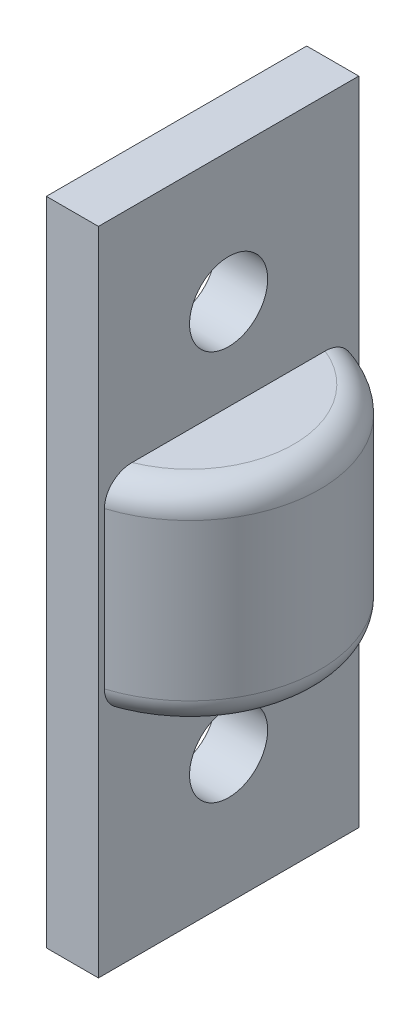
ISO-10303-21;
HEADER;
FILE_DESCRIPTION(('STEP AP214'),'2;1');
FILE_NAME('part.step','',(''),(''),'','','');
FILE_SCHEMA(('AUTOMOTIVE_DESIGN { 1 0 10303 214 1 1 1 1 }'));
ENDSEC;
DATA;
#1=APPLICATION_CONTEXT('core data for automotive mechanical design processes');
#2=APPLICATION_PROTOCOL_DEFINITION('international standard','automotive_design',2000,#1);
#3=PRODUCT_CONTEXT('',#1,'mechanical');
#4=PRODUCT('Part','Part','',(#3));
#5=PRODUCT_RELATED_PRODUCT_CATEGORY('part','',(#4));
#6=PRODUCT_DEFINITION_FORMATION('','',#4);
#7=PRODUCT_DEFINITION_CONTEXT('part definition',#1,'design');
#8=PRODUCT_DEFINITION('design','',#6,#7);
#9=PRODUCT_DEFINITION_SHAPE('','',#8);
#10=(LENGTH_UNIT() NAMED_UNIT(*) SI_UNIT(.MILLI.,.METRE.));
#11=(NAMED_UNIT(*) PLANE_ANGLE_UNIT() SI_UNIT($,.RADIAN.));
#12=(NAMED_UNIT(*) SI_UNIT($,.STERADIAN.) SOLID_ANGLE_UNIT());
#13=UNCERTAINTY_MEASURE_WITH_UNIT(LENGTH_MEASURE(1.E-05),#10,'distance_accuracy_value','');
#14=(GEOMETRIC_REPRESENTATION_CONTEXT(3) GLOBAL_UNCERTAINTY_ASSIGNED_CONTEXT((#13)) GLOBAL_UNIT_ASSIGNED_CONTEXT((#10,
#11,#12)) REPRESENTATION_CONTEXT('',''));
#15=CARTESIAN_POINT('',(0.,0.,0.));
#16=DIRECTION('',(0.,0.,1.));
#17=DIRECTION('',(1.,0.,0.));
#18=AXIS2_PLACEMENT_3D('',#15,#16,#17);
#19=CARTESIAN_POINT('',(-18.145,0.,0.));
#20=DIRECTION('',(-1.,0.,0.));
#21=DIRECTION('',(0.,0.,1.));
#22=AXIS2_PLACEMENT_3D('',#19,#20,#21);
#23=PLANE('',#22);
#24=DIRECTION('',(0.,0.,1.));
#25=VECTOR('',#24,1.);
#26=CARTESIAN_POINT('',(-18.145,44.,0.));
#27=LINE('',#26,#25);
#28=CARTESIAN_POINT('',(-18.145,44.,-3.70809924354784));
#29=VERTEX_POINT('',#28);
#30=CARTESIAN_POINT('',(-18.145,44.,3.70809924354783));
#31=VERTEX_POINT('',#30);
#32=EDGE_CURVE('E276',#29,#31,#27,.T.);
#33=ORIENTED_EDGE('',*,*,#32,.F.);
#34=CARTESIAN_POINT('',(-18.145,44.,-3.70809924354784));
#35=CARTESIAN_POINT('',(-18.145,44.0000446746882,-3.77102859400737));
#36=CARTESIAN_POINT('',(-18.145,43.9948961277134,-3.83399883726668));
#37=CARTESIAN_POINT('',(-18.145,43.9742609840635,-3.95834328277488));
#38=CARTESIAN_POINT('',(-18.145,43.958754051116,-4.01971409817624));
#39=CARTESIAN_POINT('',(-18.145,43.9174111192131,-4.13903451433262));
#40=CARTESIAN_POINT('',(-18.145,43.891555303476,-4.19697730511149));
#41=CARTESIAN_POINT('',(-18.145,43.8300151578696,-4.30732646589592));
#42=CARTESIAN_POINT('',(-18.145,43.7943420282415,-4.35973905142012));
#43=CARTESIAN_POINT('',(-18.145,43.7159910488128,-4.45479511595231));
#44=CARTESIAN_POINT('',(-18.145,43.6737411462038,-4.49779102539527));
#45=CARTESIAN_POINT('',(-18.145,43.5822190602416,-4.57557133751087));
#46=CARTESIAN_POINT('',(-18.145,43.5329460413457,-4.61035476183133));
#47=CARTESIAN_POINT('',(-18.145,43.4318401587707,-4.6686432086811));
#48=CARTESIAN_POINT('',(-18.145,43.3803104169747,-4.6926755056348));
#49=CARTESIAN_POINT('',(-18.145,43.2738685201121,-4.73132778720933));
#50=CARTESIAN_POINT('',(-18.145,43.2189610978374,-4.74596062734654));
#51=CARTESIAN_POINT('',(-18.145,43.1362834236849,-4.76031205030439));
#52=CARTESIAN_POINT('',(-18.145,43.1091245864456,-4.76383034109844));
#53=CARTESIAN_POINT('',(-18.145,43.0546484674691,-4.76852044482377));
#54=CARTESIAN_POINT('',(-18.145,43.0273315053115,-4.76969597014627));
#55=CARTESIAN_POINT('',(-18.145,43.0000000000001,-4.7696960070853));
#56=B_SPLINE_CURVE_WITH_KNOTS('',3,(#34,#35,#36,#37,#38,#39,#40,#41,#42,#43,#44,#45,#46,#47,#48,
#49,#50,#51,#52,#53,#54,#55),.UNSPECIFIED.,.F.,.F.,(4,2,2,2,2,2,2,2,2,2,4),(0.,
0.188641243323365,0.377653932466057,0.567030301565425,0.756191506888005,0.936100666565799,
1.11603124799425,1.28576923499191,1.45527457643828,1.53734522992803,1.61928572894716),.UNSPECIFIED.);
#57=CARTESIAN_POINT('',(-18.145,43.,-4.76969600708474));
#58=VERTEX_POINT('',#57);
#59=EDGE_CURVE('E79',#29,#58,#56,.T.);
#60=ORIENTED_EDGE('',*,*,#59,.T.);
#61=DIRECTION('',(0.,1.,0.));
#62=VECTOR('',#61,1.);
#63=CARTESIAN_POINT('',(-18.145,36.,-4.76969600708474));
#64=LINE('',#63,#62);
#65=CARTESIAN_POINT('',(-18.145,37.,-4.76969600708474));
#66=VERTEX_POINT('',#65);
#67=EDGE_CURVE('E243',#58,#66,#64,.F.);
#68=ORIENTED_EDGE('',*,*,#67,.T.);
#69=CARTESIAN_POINT('',(-18.145,37.,-4.76969600708474));
#70=CARTESIAN_POINT('',(-18.145,36.9728613139467,-4.76969635914148));
#71=CARTESIAN_POINT('',(-18.145,36.9457359090888,-4.76853712593869));
#72=CARTESIAN_POINT('',(-18.145,36.8916852893732,-4.76391614830527));
#73=CARTESIAN_POINT('',(-18.145,36.8647600501857,-4.76045468849165));
#74=CARTESIAN_POINT('',(-18.145,36.7846819302502,-4.74666684001058));
#75=CARTESIAN_POINT('',(-18.145,36.7320755550965,-4.73293676807672));
#76=CARTESIAN_POINT('',(-18.145,36.6299337068901,-4.6968653817904));
#77=CARTESIAN_POINT('',(-18.145,36.5803985756353,-4.67452311097832));
#78=CARTESIAN_POINT('',(-18.145,36.4856890099206,-4.62196987080802));
#79=CARTESIAN_POINT('',(-18.145,36.4405151740703,-4.59175782338197));
#80=CARTESIAN_POINT('',(-18.145,36.3549484462929,-4.52386060747544));
#81=CARTESIAN_POINT('',(-18.145,36.3146484855173,-4.48605855971889));
#82=CARTESIAN_POINT('',(-18.145,36.2406469831803,-4.40447784597852));
#83=CARTESIAN_POINT('',(-18.145,36.2069464121679,-4.36069830251006));
#84=CARTESIAN_POINT('',(-18.145,36.1454971682573,-4.26639809644509));
#85=CARTESIAN_POINT('',(-18.145,36.1180726458081,-4.21566655232883));
#86=CARTESIAN_POINT('',(-18.145,36.0716017392263,-4.11048517581056));
#87=CARTESIAN_POINT('',(-18.145,36.0525589864421,-4.05603374356923));
#88=CARTESIAN_POINT('',(-18.145,36.0251846684092,-3.9527822243443));
#89=CARTESIAN_POINT('',(-18.145,36.0157158103072,-3.90427812762391));
#90=CARTESIAN_POINT('',(-18.145,36.0031231493299,-3.80654596165672));
#91=CARTESIAN_POINT('',(-18.145,35.9999871322951,-3.75731947085155));
#92=CARTESIAN_POINT('',(-18.145,36.,-3.70809924354784));
#93=B_SPLINE_CURVE_WITH_KNOTS('',3,(#69,#70,#71,#72,#73,#74,#75,#76,#77,#78,#79,#80,#81,#82,#83,
#84,#85,#86,#87,#88,#89,#90,#91,#92),.UNSPECIFIED.,.F.,.F.,(4,2,2,2,2,2,2,2,2,2,2,4),(0.,
0.0813650770143812,0.162720096990514,0.324982741139785,0.487263411161867,0.649566323449299,
0.814592353526024,0.979642635198515,1.15189995289374,1.32423182669581,1.47208339913565,
1.61964953663185),.UNSPECIFIED.);
#94=CARTESIAN_POINT('',(-18.145,36.,-3.70809924354784));
#95=VERTEX_POINT('',#94);
#96=EDGE_CURVE('E191',#66,#95,#93,.T.);
#97=ORIENTED_EDGE('',*,*,#96,.T.);
#98=DIRECTION('',(0.,0.,1.));
#99=VECTOR('',#98,1.);
#100=CARTESIAN_POINT('',(-18.145,36.,0.));
#101=LINE('',#100,#99);
#102=CARTESIAN_POINT('',(-18.145,36.,3.70809924354783));
#103=VERTEX_POINT('',#102);
#104=EDGE_CURVE('E273',#95,#103,#101,.T.);
#105=ORIENTED_EDGE('',*,*,#104,.T.);
#106=CARTESIAN_POINT('',(-18.145,36.,3.70809924354783));
#107=CARTESIAN_POINT('',(-18.145,35.9999553253118,3.77102859400736));
#108=CARTESIAN_POINT('',(-18.145,36.0051038722866,3.83399883726667));
#109=CARTESIAN_POINT('',(-18.145,36.0257390159365,3.95834328277487));
#110=CARTESIAN_POINT('',(-18.145,36.041245948884,4.01971409817623));
#111=CARTESIAN_POINT('',(-18.145,36.0825888807869,4.13903451433261));
#112=CARTESIAN_POINT('',(-18.145,36.108444696524,4.19697730511148));
#113=CARTESIAN_POINT('',(-18.145,36.1699848421304,4.3073264658959));
#114=CARTESIAN_POINT('',(-18.145,36.2056579717585,4.35973905142011));
#115=CARTESIAN_POINT('',(-18.145,36.2840089511872,4.4547951159523));
#116=CARTESIAN_POINT('',(-18.145,36.3262588537962,4.49779102539526));
#117=CARTESIAN_POINT('',(-18.145,36.4177809397584,4.57557133751087));
#118=CARTESIAN_POINT('',(-18.145,36.4670539586543,4.61035476183132));
#119=CARTESIAN_POINT('',(-18.145,36.5681598412293,4.66864320868109));
#120=CARTESIAN_POINT('',(-18.145,36.6196895830253,4.69267550563478));
#121=CARTESIAN_POINT('',(-18.145,36.7261314798879,4.73132778720932));
#122=CARTESIAN_POINT('',(-18.145,36.7810389021626,4.74596062734653));
#123=CARTESIAN_POINT('',(-18.145,36.8637165763151,4.76031205030439));
#124=CARTESIAN_POINT('',(-18.145,36.8908754135544,4.76383034109843));
#125=CARTESIAN_POINT('',(-18.145,36.9453515325309,4.76852044482376));
#126=CARTESIAN_POINT('',(-18.145,36.9726684946885,4.76969597014626));
#127=CARTESIAN_POINT('',(-18.145,36.9999999999999,4.76969600708529));
#128=B_SPLINE_CURVE_WITH_KNOTS('',3,(#106,#107,#108,#109,#110,#111,#112,#113,#114,#115,#116,
#117,#118,#119,#120,#121,#122,#123,#124,#125,#126,#127),.UNSPECIFIED.,.F.,.F.,(4,2,2,2,2,2,2,2,
2,2,4),(0.,0.188641243323364,0.377653932466055,0.567030301565422,0.756191506887999,
0.936100666565806,1.11603124799424,1.2857692349919,1.45527457643828,1.53734522992803,
1.61928572894715),.UNSPECIFIED.);
#129=CARTESIAN_POINT('',(-18.145,37.,4.76969600708473));
#130=VERTEX_POINT('',#129);
#131=EDGE_CURVE('E197',#103,#130,#128,.T.);
#132=ORIENTED_EDGE('',*,*,#131,.T.);
#133=DIRECTION('',(0.,1.,0.));
#134=VECTOR('',#133,1.);
#135=CARTESIAN_POINT('',(-18.145,36.,4.76969600708473));
#136=LINE('',#135,#134);
#137=CARTESIAN_POINT('',(-18.145,43.,4.76969600708473));
#138=VERTEX_POINT('',#137);
#139=EDGE_CURVE('E239',#130,#138,#136,.T.);
#140=ORIENTED_EDGE('',*,*,#139,.T.);
#141=CARTESIAN_POINT('',(-18.145,43.,4.76969600708473));
#142=CARTESIAN_POINT('',(-18.145,43.0271386860533,4.76969635914147));
#143=CARTESIAN_POINT('',(-18.145,43.0542640909112,4.76853712593868));
#144=CARTESIAN_POINT('',(-18.145,43.1083147106268,4.76391614830526));
#145=CARTESIAN_POINT('',(-18.145,43.1352399498143,4.76045468849164));
#146=CARTESIAN_POINT('',(-18.145,43.2153180697498,4.74666684001057));
#147=CARTESIAN_POINT('',(-18.145,43.2679244449035,4.73293676807672));
#148=CARTESIAN_POINT('',(-18.145,43.3700662931099,4.69686538179039));
#149=CARTESIAN_POINT('',(-18.145,43.4196014243647,4.67452311097831));
#150=CARTESIAN_POINT('',(-18.145,43.5143109900794,4.62196987080801));
#151=CARTESIAN_POINT('',(-18.145,43.5594848259297,4.59175782338196));
#152=CARTESIAN_POINT('',(-18.145,43.6450515537071,4.52386060747544));
#153=CARTESIAN_POINT('',(-18.145,43.6853515144827,4.48605855971888));
#154=CARTESIAN_POINT('',(-18.145,43.7593530168197,4.40447784597851));
#155=CARTESIAN_POINT('',(-18.145,43.7930535878321,4.36069830251005));
#156=CARTESIAN_POINT('',(-18.145,43.8545028317427,4.26639809644508));
#157=CARTESIAN_POINT('',(-18.145,43.8819273541919,4.21566655232882));
#158=CARTESIAN_POINT('',(-18.145,43.9283982607737,4.11048517581055));
#159=CARTESIAN_POINT('',(-18.145,43.9474410135579,4.05603374356921));
#160=CARTESIAN_POINT('',(-18.145,43.9748153315908,3.95278222434429));
#161=CARTESIAN_POINT('',(-18.145,43.9842841896928,3.9042781276239));
#162=CARTESIAN_POINT('',(-18.145,43.9968768506701,3.80654596165671));
#163=CARTESIAN_POINT('',(-18.145,44.0000128677049,3.75731947085154));
#164=CARTESIAN_POINT('',(-18.145,44.,3.70809924354783));
#165=B_SPLINE_CURVE_WITH_KNOTS('',3,(#141,#142,#143,#144,#145,#146,#147,#148,#149,#150,#151,
#152,#153,#154,#155,#156,#157,#158,#159,#160,#161,#162,#163,#164),.UNSPECIFIED.,.F.,.F.,(4,2,2,
2,2,2,2,2,2,2,2,4),(0.,0.0813650770143811,0.162720096990514,0.324982741139785,0.487263411161868,
0.649566323449298,0.814592353526024,0.979642635198515,1.15189995289374,1.32423182669581,
1.47208339913565,1.61964953663185),.UNSPECIFIED.);
#166=EDGE_CURVE('E12',#138,#31,#165,.T.);
#167=ORIENTED_EDGE('',*,*,#166,.T.);
#168=EDGE_LOOP('',(#33,#60,#68,#97,#105,#132,#140,#167));
#169=FACE_BOUND('',#168,.T.);
#170=DIRECTION('',(0.,0.,-1.));
#171=VECTOR('',#170,1.);
#172=CARTESIAN_POINT('',(-18.145,52.5,5.));
#173=LINE('',#172,#171);
#174=CARTESIAN_POINT('',(-18.145,52.5,5.));
#175=VERTEX_POINT('',#174);
#176=CARTESIAN_POINT('',(-18.145,52.5,-4.99999999999999));
#177=VERTEX_POINT('',#176);
#178=EDGE_CURVE('E154',#175,#177,#173,.T.);
#179=ORIENTED_EDGE('',*,*,#178,.F.);
#180=DIRECTION('',(0.,1.,0.));
#181=VECTOR('',#180,1.);
#182=CARTESIAN_POINT('',(-18.145,27.5,4.99999999999999));
#183=LINE('',#182,#181);
#184=CARTESIAN_POINT('',(-18.145,27.5,4.99999999999999));
#185=VERTEX_POINT('',#184);
#186=EDGE_CURVE('E147',#185,#175,#183,.T.);
#187=ORIENTED_EDGE('',*,*,#186,.F.);
#188=DIRECTION('',(0.,0.,1.));
#189=VECTOR('',#188,1.);
#190=CARTESIAN_POINT('',(-18.145,27.5,-5.));
#191=LINE('',#190,#189);
#192=CARTESIAN_POINT('',(-18.145,27.5,-5.));
#193=VERTEX_POINT('',#192);
#194=EDGE_CURVE('E157',#193,#185,#191,.T.);
#195=ORIENTED_EDGE('',*,*,#194,.F.);
#196=DIRECTION('',(0.,-1.,0.));
#197=VECTOR('',#196,1.);
#198=CARTESIAN_POINT('',(-18.145,52.5,-4.99999999999999));
#199=LINE('',#198,#197);
#200=EDGE_CURVE('E139',#177,#193,#199,.T.);
#201=ORIENTED_EDGE('',*,*,#200,.F.);
#202=EDGE_LOOP('',(#179,#187,#195,#201));
#203=FACE_BOUND('',#202,.T.);
#204=CARTESIAN_POINT('',(-18.145,47.5,0.));
#205=DIRECTION('',(1.,0.,0.));
#206=DIRECTION('',(0.,0.,-1.));
#207=AXIS2_PLACEMENT_3D('',#204,#205,#206);
#208=CIRCLE('',#207,1.5);
#209=CARTESIAN_POINT('',(-18.145,47.5,-1.5));
#210=VERTEX_POINT('',#209);
#211=EDGE_CURVE('E174',#210,#210,#208,.T.);
#212=ORIENTED_EDGE('',*,*,#211,.F.);
#213=EDGE_LOOP('',(#212));
#214=FACE_BOUND('',#213,.T.);
#215=CARTESIAN_POINT('',(-18.145,32.5,0.));
#216=DIRECTION('',(1.,0.,0.));
#217=DIRECTION('',(0.,0.,-1.));
#218=AXIS2_PLACEMENT_3D('',#215,#216,#217);
#219=CIRCLE('',#218,1.5);
#220=CARTESIAN_POINT('',(-18.145,32.5,-1.5));
#221=VERTEX_POINT('',#220);
#222=EDGE_CURVE('E238',#221,#221,#219,.T.);
#223=ORIENTED_EDGE('',*,*,#222,.F.);
#224=EDGE_LOOP('',(#223));
#225=FACE_BOUND('',#224,.T.);
#226=ADVANCED_FACE('F65',(#169,#203,#214,#225),#23,.F.);
#227=CARTESIAN_POINT('',(-20.145,0.,0.));
#228=DIRECTION('',(-1.,0.,0.));
#229=DIRECTION('',(0.,0.,1.));
#230=AXIS2_PLACEMENT_3D('',#227,#228,#229);
#231=PLANE('',#230);
#232=CARTESIAN_POINT('',(-20.145,47.5,0.));
#233=DIRECTION('',(1.,0.,0.));
#234=DIRECTION('',(0.,0.,-1.));
#235=AXIS2_PLACEMENT_3D('',#232,#233,#234);
#236=CIRCLE('',#235,1.5);
#237=CARTESIAN_POINT('',(-20.145,47.5,-1.5));
#238=VERTEX_POINT('',#237);
#239=EDGE_CURVE('E167',#238,#238,#236,.T.);
#240=ORIENTED_EDGE('',*,*,#239,.T.);
#241=EDGE_LOOP('',(#240));
#242=FACE_BOUND('',#241,.T.);
#243=DIRECTION('',(0.,0.,-1.));
#244=VECTOR('',#243,1.);
#245=CARTESIAN_POINT('',(-20.145,52.5,5.));
#246=LINE('',#245,#244);
#247=CARTESIAN_POINT('',(-20.145,52.5,5.));
#248=VERTEX_POINT('',#247);
#249=CARTESIAN_POINT('',(-20.145,52.5,-4.99999999999999));
#250=VERTEX_POINT('',#249);
#251=EDGE_CURVE('E172',#248,#250,#246,.T.);
#252=ORIENTED_EDGE('',*,*,#251,.T.);
#253=DIRECTION('',(0.,-1.,0.));
#254=VECTOR('',#253,1.);
#255=CARTESIAN_POINT('',(-20.145,52.5,-4.99999999999999));
#256=LINE('',#255,#254);
#257=CARTESIAN_POINT('',(-20.145,27.5,-5.));
#258=VERTEX_POINT('',#257);
#259=EDGE_CURVE('E141',#250,#258,#256,.T.);
#260=ORIENTED_EDGE('',*,*,#259,.T.);
#261=DIRECTION('',(0.,0.,1.));
#262=VECTOR('',#261,1.);
#263=CARTESIAN_POINT('',(-20.145,27.5,-5.));
#264=LINE('',#263,#262);
#265=CARTESIAN_POINT('',(-20.145,27.5,4.99999999999999));
#266=VERTEX_POINT('',#265);
#267=EDGE_CURVE('E164',#258,#266,#264,.T.);
#268=ORIENTED_EDGE('',*,*,#267,.T.);
#269=DIRECTION('',(0.,1.,0.));
#270=VECTOR('',#269,1.);
#271=CARTESIAN_POINT('',(-20.145,27.5,4.99999999999999));
#272=LINE('',#271,#270);
#273=EDGE_CURVE('E161',#266,#248,#272,.T.);
#274=ORIENTED_EDGE('',*,*,#273,.T.);
#275=EDGE_LOOP('',(#252,#260,#268,#274));
#276=FACE_BOUND('',#275,.T.);
#277=CARTESIAN_POINT('',(-20.145,32.5,0.));
#278=DIRECTION('',(1.,0.,0.));
#279=DIRECTION('',(0.,0.,-1.));
#280=AXIS2_PLACEMENT_3D('',#277,#278,#279);
#281=CIRCLE('',#280,1.5);
#282=CARTESIAN_POINT('',(-20.145,32.5,-1.5));
#283=VERTEX_POINT('',#282);
#284=EDGE_CURVE('E236',#283,#283,#281,.T.);
#285=ORIENTED_EDGE('',*,*,#284,.T.);
#286=EDGE_LOOP('',(#285));
#287=FACE_BOUND('',#286,.T.);
#288=ADVANCED_FACE('F215',(#242,#276,#287),#231,.T.);
#289=CARTESIAN_POINT('',(-18.145,52.5,5.));
#290=DIRECTION('',(0.,1.,0.));
#291=DIRECTION('',(0.,0.,1.));
#292=AXIS2_PLACEMENT_3D('',#289,#290,#291);
#293=PLANE('',#292);
#294=ORIENTED_EDGE('',*,*,#251,.F.);
#295=DIRECTION('',(-1.,0.,0.));
#296=VECTOR('',#295,1.);
#297=CARTESIAN_POINT('',(-18.145,52.5,5.));
#298=LINE('',#297,#296);
#299=EDGE_CURVE('E160',#175,#248,#298,.T.);
#300=ORIENTED_EDGE('',*,*,#299,.F.);
#301=ORIENTED_EDGE('',*,*,#178,.T.);
#302=DIRECTION('',(-1.,0.,0.));
#303=VECTOR('',#302,1.);
#304=CARTESIAN_POINT('',(-18.145,52.5,-4.99999999999999));
#305=LINE('',#304,#303);
#306=EDGE_CURVE('E136',#177,#250,#305,.T.);
#307=ORIENTED_EDGE('',*,*,#306,.T.);
#308=EDGE_LOOP('',(#294,#300,#301,#307));
#309=FACE_BOUND('',#308,.T.);
#310=ADVANCED_FACE('F159',(#309),#293,.T.);
#311=CARTESIAN_POINT('',(-18.145,27.5,4.99999999999999));
#312=DIRECTION('',(0.,0.,1.));
#313=DIRECTION('',(0.,-1.,0.));
#314=AXIS2_PLACEMENT_3D('',#311,#312,#313);
#315=PLANE('',#314);
#316=ORIENTED_EDGE('',*,*,#273,.F.);
#317=DIRECTION('',(-1.,0.,0.));
#318=VECTOR('',#317,1.);
#319=CARTESIAN_POINT('',(-18.145,27.5,4.99999999999999));
#320=LINE('',#319,#318);
#321=EDGE_CURVE('E180',#185,#266,#320,.T.);
#322=ORIENTED_EDGE('',*,*,#321,.F.);
#323=ORIENTED_EDGE('',*,*,#186,.T.);
#324=ORIENTED_EDGE('',*,*,#299,.T.);
#325=EDGE_LOOP('',(#316,#322,#323,#324));
#326=FACE_BOUND('',#325,.T.);
#327=ADVANCED_FACE('F214',(#326),#315,.T.);
#328=CARTESIAN_POINT('',(-18.145,27.5,-5.));
#329=DIRECTION('',(0.,-1.,0.));
#330=DIRECTION('',(1.,0.,0.));
#331=AXIS2_PLACEMENT_3D('',#328,#329,#330);
#332=PLANE('',#331);
#333=ORIENTED_EDGE('',*,*,#267,.F.);
#334=DIRECTION('',(-1.,0.,0.));
#335=VECTOR('',#334,1.);
#336=CARTESIAN_POINT('',(-18.145,27.5,-5.));
#337=LINE('',#336,#335);
#338=EDGE_CURVE('E146',#193,#258,#337,.T.);
#339=ORIENTED_EDGE('',*,*,#338,.F.);
#340=ORIENTED_EDGE('',*,*,#194,.T.);
#341=ORIENTED_EDGE('',*,*,#321,.T.);
#342=EDGE_LOOP('',(#333,#339,#340,#341));
#343=FACE_BOUND('',#342,.T.);
#344=ADVANCED_FACE('F219',(#343),#332,.T.);
#345=CARTESIAN_POINT('',(-18.145,52.5,-4.99999999999999));
#346=DIRECTION('',(0.,0.,-1.));
#347=DIRECTION('',(0.,1.,0.));
#348=AXIS2_PLACEMENT_3D('',#345,#346,#347);
#349=PLANE('',#348);
#350=ORIENTED_EDGE('',*,*,#259,.F.);
#351=ORIENTED_EDGE('',*,*,#306,.F.);
#352=ORIENTED_EDGE('',*,*,#200,.T.);
#353=ORIENTED_EDGE('',*,*,#338,.T.);
#354=EDGE_LOOP('',(#350,#351,#352,#353));
#355=FACE_BOUND('',#354,.T.);
#356=ADVANCED_FACE('F138',(#355),#349,.T.);
#357=CARTESIAN_POINT('',(-18.145,47.5,0.));
#358=DIRECTION('',(-1.,0.,0.));
#359=DIRECTION('',(0.,0.,1.));
#360=AXIS2_PLACEMENT_3D('',#357,#358,#359);
#361=CYLINDRICAL_SURFACE('',#360,1.5);
#362=ORIENTED_EDGE('',*,*,#211,.T.);
#363=EDGE_LOOP('',(#362));
#364=FACE_BOUND('',#363,.T.);
#365=ORIENTED_EDGE('',*,*,#239,.F.);
#366=EDGE_LOOP('',(#365));
#367=FACE_BOUND('',#366,.T.);
#368=ADVANCED_FACE('F218',(#364,#367),#361,.F.);
#369=CARTESIAN_POINT('',(-18.145,32.5,0.));
#370=DIRECTION('',(-1.,0.,0.));
#371=DIRECTION('',(0.,0.,1.));
#372=AXIS2_PLACEMENT_3D('',#369,#370,#371);
#373=CYLINDRICAL_SURFACE('',#372,1.5);
#374=ORIENTED_EDGE('',*,*,#222,.T.);
#375=EDGE_LOOP('',(#374));
#376=FACE_BOUND('',#375,.T.);
#377=ORIENTED_EDGE('',*,*,#284,.F.);
#378=EDGE_LOOP('',(#377));
#379=FACE_BOUND('',#378,.T.);
#380=ADVANCED_FACE('F252',(#376,#379),#373,.F.);
#381=CARTESIAN_POINT('',(-19.645,36.,0.));
#382=DIRECTION('',(0.,1.,0.));
#383=DIRECTION('',(-1.,0.,0.));
#384=AXIS2_PLACEMENT_3D('',#381,#382,#383);
#385=CYLINDRICAL_SURFACE('',#384,5.);
#386=ORIENTED_EDGE('',*,*,#139,.F.);
#387=CARTESIAN_POINT('',(-19.645,37.,0.));
#388=DIRECTION('',(0.,-1.,0.));
#389=DIRECTION('',(1.,0.,0.));
#390=AXIS2_PLACEMENT_3D('',#387,#388,#389);
#391=CIRCLE('',#390,5.);
#392=EDGE_CURVE('E184',#130,#66,#391,.F.);
#393=ORIENTED_EDGE('',*,*,#392,.T.);
#394=ORIENTED_EDGE('',*,*,#67,.F.);
#395=CARTESIAN_POINT('',(-19.645,43.,0.));
#396=DIRECTION('',(0.,-1.,0.));
#397=DIRECTION('',(1.,0.,0.));
#398=AXIS2_PLACEMENT_3D('',#395,#396,#397);
#399=CIRCLE('',#398,5.);
#400=EDGE_CURVE('E179',#58,#138,#399,.T.);
#401=ORIENTED_EDGE('',*,*,#400,.T.);
#402=EDGE_LOOP('',(#386,#393,#394,#401));
#403=FACE_BOUND('',#402,.T.);
#404=ADVANCED_FACE('F254',(#403),#385,.T.);
#405=CARTESIAN_POINT('',(-19.645,36.,0.));
#406=DIRECTION('',(0.,-1.,0.));
#407=DIRECTION('',(1.,0.,0.));
#408=AXIS2_PLACEMENT_3D('',#405,#406,#407);
#409=PLANE('',#408);
#410=ORIENTED_EDGE('',*,*,#104,.F.);
#411=CARTESIAN_POINT('',(-19.645,36.,0.));
#412=DIRECTION('',(0.,-1.,0.));
#413=DIRECTION('',(1.,0.,0.));
#414=AXIS2_PLACEMENT_3D('',#411,#412,#413);
#415=CIRCLE('',#414,4.);
#416=EDGE_CURVE('E187',#95,#103,#415,.T.);
#417=ORIENTED_EDGE('',*,*,#416,.T.);
#418=EDGE_LOOP('',(#410,#417));
#419=FACE_BOUND('',#418,.T.);
#420=ADVANCED_FACE('F260',(#419),#409,.T.);
#421=CARTESIAN_POINT('',(-19.645,44.,0.));
#422=DIRECTION('',(0.,-1.,0.));
#423=DIRECTION('',(1.,0.,0.));
#424=AXIS2_PLACEMENT_3D('',#421,#422,#423);
#425=PLANE('',#424);
#426=ORIENTED_EDGE('',*,*,#32,.T.);
#427=CARTESIAN_POINT('',(-19.645,44.,0.));
#428=DIRECTION('',(0.,-1.,0.));
#429=DIRECTION('',(1.,0.,0.));
#430=AXIS2_PLACEMENT_3D('',#427,#428,#429);
#431=CIRCLE('',#430,4.);
#432=EDGE_CURVE('E189',#31,#29,#431,.F.);
#433=ORIENTED_EDGE('',*,*,#432,.T.);
#434=EDGE_LOOP('',(#426,#433));
#435=FACE_BOUND('',#434,.T.);
#436=ADVANCED_FACE('F209',(#435),#425,.F.);
#437=CARTESIAN_POINT('',(-19.645,37.,0.));
#438=DIRECTION('',(0.,-1.,0.));
#439=DIRECTION('',(1.,0.,0.));
#440=AXIS2_PLACEMENT_3D('',#437,#438,#439);
#441=TOROIDAL_SURFACE('',#440,4.,1.);
#442=ORIENTED_EDGE('',*,*,#131,.F.);
#443=ORIENTED_EDGE('',*,*,#416,.F.);
#444=ORIENTED_EDGE('',*,*,#96,.F.);
#445=ORIENTED_EDGE('',*,*,#392,.F.);
#446=EDGE_LOOP('',(#442,#443,#444,#445));
#447=FACE_BOUND('',#446,.T.);
#448=ADVANCED_FACE('F205',(#447),#441,.T.);
#449=CARTESIAN_POINT('',(-19.645,43.,0.));
#450=DIRECTION('',(0.,-1.,0.));
#451=DIRECTION('',(1.,0.,0.));
#452=AXIS2_PLACEMENT_3D('',#449,#450,#451);
#453=TOROIDAL_SURFACE('',#452,4.,1.);
#454=ORIENTED_EDGE('',*,*,#166,.F.);
#455=ORIENTED_EDGE('',*,*,#400,.F.);
#456=ORIENTED_EDGE('',*,*,#59,.F.);
#457=ORIENTED_EDGE('',*,*,#432,.F.);
#458=EDGE_LOOP('',(#454,#455,#456,#457));
#459=FACE_BOUND('',#458,.T.);
#460=ADVANCED_FACE('F67',(#459),#453,.T.);
#461=CLOSED_SHELL('',(#226,#288,#310,#327,#344,#356,#368,#380,#404,#420,#436,#448,#460));
#462=MANIFOLD_SOLID_BREP('B2',#461);
#463=ADVANCED_BREP_SHAPE_REPRESENTATION('',(#18,#462),#14);
#464=SHAPE_DEFINITION_REPRESENTATION(#9,#463);
ENDSEC;
END-ISO-10303-21;
